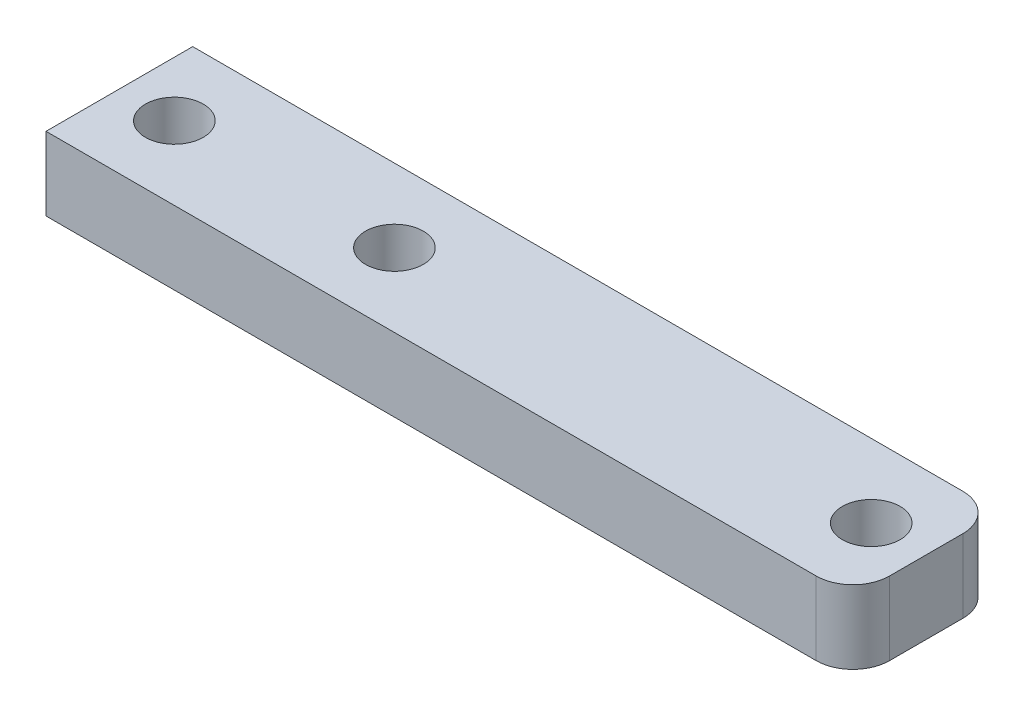
ISO-10303-21;
HEADER;
FILE_DESCRIPTION(('STEP AP214'),'2;1');
FILE_NAME('part.step','',(''),(''),'','','');
FILE_SCHEMA(('AUTOMOTIVE_DESIGN { 1 0 10303 214 1 1 1 1 }'));
ENDSEC;
DATA;
#1=APPLICATION_CONTEXT('core data for automotive mechanical design processes');
#2=APPLICATION_PROTOCOL_DEFINITION('international standard','automotive_design',2000,#1);
#3=PRODUCT_CONTEXT('',#1,'mechanical');
#4=PRODUCT('Part','Part','',(#3));
#5=PRODUCT_RELATED_PRODUCT_CATEGORY('part','',(#4));
#6=PRODUCT_DEFINITION_FORMATION('','',#4);
#7=PRODUCT_DEFINITION_CONTEXT('part definition',#1,'design');
#8=PRODUCT_DEFINITION('design','',#6,#7);
#9=PRODUCT_DEFINITION_SHAPE('','',#8);
#10=(LENGTH_UNIT() NAMED_UNIT(*) SI_UNIT(.MILLI.,.METRE.));
#11=(NAMED_UNIT(*) PLANE_ANGLE_UNIT() SI_UNIT($,.RADIAN.));
#12=(NAMED_UNIT(*) SI_UNIT($,.STERADIAN.) SOLID_ANGLE_UNIT());
#13=UNCERTAINTY_MEASURE_WITH_UNIT(LENGTH_MEASURE(1.E-05),#10,'distance_accuracy_value','');
#14=(GEOMETRIC_REPRESENTATION_CONTEXT(3) GLOBAL_UNCERTAINTY_ASSIGNED_CONTEXT((#13)) GLOBAL_UNIT_ASSIGNED_CONTEXT((#10,
#11,#12)) REPRESENTATION_CONTEXT('',''));
#15=CARTESIAN_POINT('',(0.,0.,0.));
#16=DIRECTION('',(0.,0.,1.));
#17=DIRECTION('',(1.,0.,0.));
#18=AXIS2_PLACEMENT_3D('',#15,#16,#17);
#19=CARTESIAN_POINT('',(0.,6.34999999999997,-6.3500000000003));
#20=DIRECTION('',(1.,0.,0.));
#21=DIRECTION('',(0.,0.,-1.));
#22=AXIS2_PLACEMENT_3D('',#19,#20,#21);
#23=PLANE('',#22);
#24=DIRECTION('',(0.,0.,1.));
#25=VECTOR('',#24,1.);
#26=CARTESIAN_POINT('',(0.,0.,-6.3500000000003));
#27=LINE('',#26,#25);
#28=CARTESIAN_POINT('',(0.,0.,-6.3500000000003));
#29=VERTEX_POINT('',#28);
#30=CARTESIAN_POINT('',(0.,0.,6.3500000000003));
#31=VERTEX_POINT('',#30);
#32=EDGE_CURVE('E109',#29,#31,#27,.T.);
#33=ORIENTED_EDGE('',*,*,#32,.T.);
#34=DIRECTION('',(0.,-1.,0.));
#35=VECTOR('',#34,1.);
#36=CARTESIAN_POINT('',(0.,6.34999999999997,6.3500000000003));
#37=LINE('',#36,#35);
#38=CARTESIAN_POINT('',(0.,6.34999999999997,6.3500000000003));
#39=VERTEX_POINT('',#38);
#40=EDGE_CURVE('E92',#39,#31,#37,.T.);
#41=ORIENTED_EDGE('',*,*,#40,.F.);
#42=DIRECTION('',(0.,0.,1.));
#43=VECTOR('',#42,1.);
#44=CARTESIAN_POINT('',(0.,6.34999999999997,-6.3500000000003));
#45=LINE('',#44,#43);
#46=CARTESIAN_POINT('',(0.,6.34999999999997,-6.3500000000003));
#47=VERTEX_POINT('',#46);
#48=EDGE_CURVE('E97',#47,#39,#45,.T.);
#49=ORIENTED_EDGE('',*,*,#48,.F.);
#50=DIRECTION('',(0.,-1.,0.));
#51=VECTOR('',#50,1.);
#52=CARTESIAN_POINT('',(0.,6.34999999999997,-6.3500000000003));
#53=LINE('',#52,#51);
#54=EDGE_CURVE('E111',#47,#29,#53,.T.);
#55=ORIENTED_EDGE('',*,*,#54,.T.);
#56=EDGE_LOOP('',(#33,#41,#49,#55));
#57=FACE_BOUND('',#56,.T.);
#58=ADVANCED_FACE('F36',(#57),#23,.F.);
#59=CARTESIAN_POINT('',(0.,6.34999999999997,6.3500000000003));
#60=DIRECTION('',(0.,0.,-1.));
#61=DIRECTION('',(-1.,0.,0.));
#62=AXIS2_PLACEMENT_3D('',#59,#60,#61);
#63=PLANE('',#62);
#64=DIRECTION('',(1.,0.,0.));
#65=VECTOR('',#64,1.);
#66=CARTESIAN_POINT('',(0.,0.,6.3500000000003));
#67=LINE('',#66,#65);
#68=CARTESIAN_POINT('',(66.6750000000001,-6.66133814775094E-13,6.3500000000003));
#69=VERTEX_POINT('',#68);
#70=EDGE_CURVE('E141',#31,#69,#67,.T.);
#71=ORIENTED_EDGE('',*,*,#70,.T.);
#72=DIRECTION('',(0.,-1.,0.));
#73=VECTOR('',#72,1.);
#74=CARTESIAN_POINT('',(66.6750000000001,6.34999999999941,6.3500000000003));
#75=LINE('',#74,#73);
#76=CARTESIAN_POINT('',(66.6750000000001,6.34999999999941,6.3500000000003));
#77=VERTEX_POINT('',#76);
#78=EDGE_CURVE('E11',#69,#77,#75,.F.);
#79=ORIENTED_EDGE('',*,*,#78,.T.);
#80=DIRECTION('',(1.,0.,0.));
#81=VECTOR('',#80,1.);
#82=CARTESIAN_POINT('',(0.,6.34999999999997,6.3500000000003));
#83=LINE('',#82,#81);
#84=EDGE_CURVE('E88',#39,#77,#83,.T.);
#85=ORIENTED_EDGE('',*,*,#84,.F.);
#86=ORIENTED_EDGE('',*,*,#40,.T.);
#87=EDGE_LOOP('',(#71,#79,#85,#86));
#88=FACE_BOUND('',#87,.T.);
#89=ADVANCED_FACE('F90',(#88),#63,.F.);
#90=CARTESIAN_POINT('',(69.8499999999998,6.34999999999952,-6.34999999999941));
#91=DIRECTION('',(-1.,0.,0.));
#92=DIRECTION('',(0.,0.,1.));
#93=AXIS2_PLACEMENT_3D('',#90,#91,#92);
#94=PLANE('',#93);
#95=DIRECTION('',(0.,0.,-1.));
#96=VECTOR('',#95,1.);
#97=CARTESIAN_POINT('',(69.8499999999998,-5.55111512312578E-13,-6.34999999999941));
#98=LINE('',#97,#96);
#99=CARTESIAN_POINT('',(69.8499999999998,-6.66133814775094E-13,3.17500000000059));
#100=VERTEX_POINT('',#99);
#101=CARTESIAN_POINT('',(69.8499999999998,-5.55111512312578E-13,-3.17499999999971));
#102=VERTEX_POINT('',#101);
#103=EDGE_CURVE('E138',#100,#102,#98,.T.);
#104=ORIENTED_EDGE('',*,*,#103,.T.);
#105=DIRECTION('',(0.,-1.,0.));
#106=VECTOR('',#105,1.);
#107=CARTESIAN_POINT('',(69.8499999999998,6.34999999999952,-3.17499999999971));
#108=LINE('',#107,#106);
#109=CARTESIAN_POINT('',(69.8499999999998,6.34999999999952,-3.17499999999971));
#110=VERTEX_POINT('',#109);
#111=EDGE_CURVE('E57',#102,#110,#108,.F.);
#112=ORIENTED_EDGE('',*,*,#111,.T.);
#113=DIRECTION('',(0.,0.,-1.));
#114=VECTOR('',#113,1.);
#115=CARTESIAN_POINT('',(69.8499999999998,6.34999999999952,-6.34999999999941));
#116=LINE('',#115,#114);
#117=CARTESIAN_POINT('',(69.8499999999998,6.34999999999941,3.17500000000059));
#118=VERTEX_POINT('',#117);
#119=EDGE_CURVE('E96',#118,#110,#116,.T.);
#120=ORIENTED_EDGE('',*,*,#119,.F.);
#121=DIRECTION('',(0.,-1.,0.));
#122=VECTOR('',#121,1.);
#123=CARTESIAN_POINT('',(69.8499999999998,6.34999999999941,3.17500000000059));
#124=LINE('',#123,#122);
#125=EDGE_CURVE('E122',#118,#100,#124,.T.);
#126=ORIENTED_EDGE('',*,*,#125,.T.);
#127=EDGE_LOOP('',(#104,#112,#120,#126));
#128=FACE_BOUND('',#127,.T.);
#129=ADVANCED_FACE('F139',(#128),#94,.F.);
#130=CARTESIAN_POINT('',(0.,6.34999999999997,-6.3500000000003));
#131=DIRECTION('',(0.,0.,1.));
#132=DIRECTION('',(1.,0.,0.));
#133=AXIS2_PLACEMENT_3D('',#130,#131,#132);
#134=PLANE('',#133);
#135=DIRECTION('',(-1.,0.,0.));
#136=VECTOR('',#135,1.);
#137=CARTESIAN_POINT('',(0.,6.34999999999997,-6.3500000000003));
#138=LINE('',#137,#136);
#139=CARTESIAN_POINT('',(66.6750000000001,6.34999999999952,-6.34999999999941));
#140=VERTEX_POINT('',#139);
#141=EDGE_CURVE('E102',#140,#47,#138,.T.);
#142=ORIENTED_EDGE('',*,*,#141,.F.);
#143=DIRECTION('',(0.,-1.,0.));
#144=VECTOR('',#143,1.);
#145=CARTESIAN_POINT('',(66.6750000000001,6.34999999999952,-6.34999999999941));
#146=LINE('',#145,#144);
#147=CARTESIAN_POINT('',(66.6750000000001,-5.55111512312578E-13,-6.34999999999941));
#148=VERTEX_POINT('',#147);
#149=EDGE_CURVE('E110',#140,#148,#146,.T.);
#150=ORIENTED_EDGE('',*,*,#149,.T.);
#151=DIRECTION('',(-1.,0.,0.));
#152=VECTOR('',#151,1.);
#153=CARTESIAN_POINT('',(0.,0.,-6.3500000000003));
#154=LINE('',#153,#152);
#155=EDGE_CURVE('E106',#148,#29,#154,.T.);
#156=ORIENTED_EDGE('',*,*,#155,.T.);
#157=ORIENTED_EDGE('',*,*,#54,.F.);
#158=EDGE_LOOP('',(#142,#150,#156,#157));
#159=FACE_BOUND('',#158,.T.);
#160=ADVANCED_FACE('F131',(#159),#134,.F.);
#161=CARTESIAN_POINT('',(0.,6.34999999999997,0.));
#162=DIRECTION('',(0.,1.,0.));
#163=DIRECTION('',(0.,0.,1.));
#164=AXIS2_PLACEMENT_3D('',#161,#162,#163);
#165=PLANE('',#164);
#166=CARTESIAN_POINT('',(4.76250000000003,6.34999999999997,8.88178419700125E-13));
#167=DIRECTION('',(0.,1.,0.));
#168=DIRECTION('',(0.,0.,1.));
#169=AXIS2_PLACEMENT_3D('',#166,#167,#168);
#170=CIRCLE('',#169,2.5);
#171=CARTESIAN_POINT('',(4.76250000000003,6.34999999999997,2.50000000000089));
#172=VERTEX_POINT('',#171);
#173=EDGE_CURVE('E162',#172,#172,#170,.T.);
#174=ORIENTED_EDGE('',*,*,#173,.F.);
#175=EDGE_LOOP('',(#174));
#176=FACE_BOUND('',#175,.T.);
#177=CARTESIAN_POINT('',(23.8125000000001,6.34999999999986,8.88178419700125E-13));
#178=DIRECTION('',(0.,1.,0.));
#179=DIRECTION('',(0.,0.,1.));
#180=AXIS2_PLACEMENT_3D('',#177,#178,#179);
#181=CIRCLE('',#180,2.5);
#182=CARTESIAN_POINT('',(23.8125000000001,6.34999999999986,2.50000000000089));
#183=VERTEX_POINT('',#182);
#184=EDGE_CURVE('E156',#183,#183,#181,.T.);
#185=ORIENTED_EDGE('',*,*,#184,.F.);
#186=EDGE_LOOP('',(#185));
#187=FACE_BOUND('',#186,.T.);
#188=CARTESIAN_POINT('',(65.0874999999998,6.34999999999952,8.88178419700125E-13));
#189=DIRECTION('',(0.,1.,0.));
#190=DIRECTION('',(0.,0.,1.));
#191=AXIS2_PLACEMENT_3D('',#188,#189,#190);
#192=CIRCLE('',#191,2.5);
#193=CARTESIAN_POINT('',(65.0874999999998,6.34999999999952,2.50000000000089));
#194=VERTEX_POINT('',#193);
#195=EDGE_CURVE('E150',#194,#194,#192,.T.);
#196=ORIENTED_EDGE('',*,*,#195,.F.);
#197=EDGE_LOOP('',(#196));
#198=FACE_BOUND('',#197,.T.);
#199=ORIENTED_EDGE('',*,*,#119,.T.);
#200=CARTESIAN_POINT('',(66.6750000000001,6.34999999999952,-3.17499999999971));
#201=DIRECTION('',(0.,1.,0.));
#202=DIRECTION('',(0.,0.,1.));
#203=AXIS2_PLACEMENT_3D('',#200,#201,#202);
#204=CIRCLE('',#203,3.175);
#205=EDGE_CURVE('E44',#110,#140,#204,.T.);
#206=ORIENTED_EDGE('',*,*,#205,.T.);
#207=ORIENTED_EDGE('',*,*,#141,.T.);
#208=ORIENTED_EDGE('',*,*,#48,.T.);
#209=ORIENTED_EDGE('',*,*,#84,.T.);
#210=CARTESIAN_POINT('',(66.6750000000001,6.34999999999941,3.17500000000059));
#211=DIRECTION('',(0.,1.,0.));
#212=DIRECTION('',(0.,0.,1.));
#213=AXIS2_PLACEMENT_3D('',#210,#211,#212);
#214=CIRCLE('',#213,3.175);
#215=EDGE_CURVE('E126',#77,#118,#214,.T.);
#216=ORIENTED_EDGE('',*,*,#215,.T.);
#217=EDGE_LOOP('',(#199,#206,#207,#208,#209,#216));
#218=FACE_BOUND('',#217,.T.);
#219=ADVANCED_FACE('F100',(#176,#187,#198,#218),#165,.T.);
#220=CARTESIAN_POINT('',(0.,0.,0.));
#221=DIRECTION('',(0.,1.,0.));
#222=DIRECTION('',(0.,0.,1.));
#223=AXIS2_PLACEMENT_3D('',#220,#221,#222);
#224=PLANE('',#223);
#225=CARTESIAN_POINT('',(4.76250000000003,0.,8.88178419700125E-13));
#226=DIRECTION('',(0.,1.,0.));
#227=DIRECTION('',(0.,0.,1.));
#228=AXIS2_PLACEMENT_3D('',#225,#226,#227);
#229=CIRCLE('',#228,2.5);
#230=CARTESIAN_POINT('',(4.76250000000003,0.,2.50000000000089));
#231=VERTEX_POINT('',#230);
#232=EDGE_CURVE('E159',#231,#231,#229,.T.);
#233=ORIENTED_EDGE('',*,*,#232,.T.);
#234=EDGE_LOOP('',(#233));
#235=FACE_BOUND('',#234,.T.);
#236=CARTESIAN_POINT('',(23.8125,-1.11022302462516E-13,8.88178419700125E-13));
#237=DIRECTION('',(0.,1.,0.));
#238=DIRECTION('',(0.,0.,1.));
#239=AXIS2_PLACEMENT_3D('',#236,#237,#238);
#240=CIRCLE('',#239,2.5);
#241=CARTESIAN_POINT('',(23.8125,-1.11022302462516E-13,2.50000000000089));
#242=VERTEX_POINT('',#241);
#243=EDGE_CURVE('E153',#242,#242,#240,.T.);
#244=ORIENTED_EDGE('',*,*,#243,.T.);
#245=EDGE_LOOP('',(#244));
#246=FACE_BOUND('',#245,.T.);
#247=CARTESIAN_POINT('',(65.0874999999998,-5.55111512312578E-13,0.));
#248=DIRECTION('',(0.,1.,0.));
#249=DIRECTION('',(0.,0.,1.));
#250=AXIS2_PLACEMENT_3D('',#247,#248,#249);
#251=CIRCLE('',#250,2.5);
#252=CARTESIAN_POINT('',(65.0874999999998,-5.55111512312578E-13,2.5));
#253=VERTEX_POINT('',#252);
#254=EDGE_CURVE('E145',#253,#253,#251,.T.);
#255=ORIENTED_EDGE('',*,*,#254,.T.);
#256=EDGE_LOOP('',(#255));
#257=FACE_BOUND('',#256,.T.);
#258=ORIENTED_EDGE('',*,*,#155,.F.);
#259=CARTESIAN_POINT('',(66.6750000000001,-5.55111512312578E-13,-3.17499999999971));
#260=DIRECTION('',(0.,1.,0.));
#261=DIRECTION('',(0.,0.,1.));
#262=AXIS2_PLACEMENT_3D('',#259,#260,#261);
#263=CIRCLE('',#262,3.175);
#264=EDGE_CURVE('E120',#148,#102,#263,.F.);
#265=ORIENTED_EDGE('',*,*,#264,.T.);
#266=ORIENTED_EDGE('',*,*,#103,.F.);
#267=CARTESIAN_POINT('',(66.6750000000001,-6.66133814775094E-13,3.17500000000059));
#268=DIRECTION('',(0.,1.,0.));
#269=DIRECTION('',(0.,0.,1.));
#270=AXIS2_PLACEMENT_3D('',#267,#268,#269);
#271=CIRCLE('',#270,3.175);
#272=EDGE_CURVE('E114',#100,#69,#271,.F.);
#273=ORIENTED_EDGE('',*,*,#272,.T.);
#274=ORIENTED_EDGE('',*,*,#70,.F.);
#275=ORIENTED_EDGE('',*,*,#32,.F.);
#276=EDGE_LOOP('',(#258,#265,#266,#273,#274,#275));
#277=FACE_BOUND('',#276,.T.);
#278=ADVANCED_FACE('F137',(#235,#246,#257,#277),#224,.F.);
#279=CARTESIAN_POINT('',(65.0874999999998,6.34999999999952,8.88178419700125E-13));
#280=DIRECTION('',(0.,1.,0.));
#281=DIRECTION('',(0.,0.,1.));
#282=AXIS2_PLACEMENT_3D('',#279,#280,#281);
#283=CYLINDRICAL_SURFACE('',#282,2.5);
#284=ORIENTED_EDGE('',*,*,#254,.F.);
#285=EDGE_LOOP('',(#284));
#286=FACE_BOUND('',#285,.T.);
#287=ORIENTED_EDGE('',*,*,#195,.T.);
#288=EDGE_LOOP('',(#287));
#289=FACE_BOUND('',#288,.T.);
#290=ADVANCED_FACE('F175',(#286,#289),#283,.F.);
#291=CARTESIAN_POINT('',(23.8125000000001,6.34999999999986,8.88178419700125E-13));
#292=DIRECTION('',(0.,1.,0.));
#293=DIRECTION('',(0.,0.,1.));
#294=AXIS2_PLACEMENT_3D('',#291,#292,#293);
#295=CYLINDRICAL_SURFACE('',#294,2.5);
#296=ORIENTED_EDGE('',*,*,#243,.F.);
#297=EDGE_LOOP('',(#296));
#298=FACE_BOUND('',#297,.T.);
#299=ORIENTED_EDGE('',*,*,#184,.T.);
#300=EDGE_LOOP('',(#299));
#301=FACE_BOUND('',#300,.T.);
#302=ADVANCED_FACE('F177',(#298,#301),#295,.F.);
#303=CARTESIAN_POINT('',(4.76250000000003,6.34999999999997,8.88178419700125E-13));
#304=DIRECTION('',(0.,1.,0.));
#305=DIRECTION('',(0.,0.,1.));
#306=AXIS2_PLACEMENT_3D('',#303,#304,#305);
#307=CYLINDRICAL_SURFACE('',#306,2.5);
#308=ORIENTED_EDGE('',*,*,#232,.F.);
#309=EDGE_LOOP('',(#308));
#310=FACE_BOUND('',#309,.T.);
#311=ORIENTED_EDGE('',*,*,#173,.T.);
#312=EDGE_LOOP('',(#311));
#313=FACE_BOUND('',#312,.T.);
#314=ADVANCED_FACE('F166',(#310,#313),#307,.F.);
#315=CARTESIAN_POINT('',(66.6750000000001,6.34999999999952,-3.17499999999971));
#316=DIRECTION('',(0.,-1.,0.));
#317=DIRECTION('',(0.,0.,-1.));
#318=AXIS2_PLACEMENT_3D('',#315,#316,#317);
#319=CYLINDRICAL_SURFACE('',#318,3.175);
#320=ORIENTED_EDGE('',*,*,#205,.F.);
#321=ORIENTED_EDGE('',*,*,#111,.F.);
#322=ORIENTED_EDGE('',*,*,#264,.F.);
#323=ORIENTED_EDGE('',*,*,#149,.F.);
#324=EDGE_LOOP('',(#320,#321,#322,#323));
#325=FACE_BOUND('',#324,.T.);
#326=ADVANCED_FACE('F134',(#325),#319,.T.);
#327=CARTESIAN_POINT('',(66.6750000000001,6.34999999999941,3.17500000000059));
#328=DIRECTION('',(0.,-1.,0.));
#329=DIRECTION('',(0.,0.,-1.));
#330=AXIS2_PLACEMENT_3D('',#327,#328,#329);
#331=CYLINDRICAL_SURFACE('',#330,3.175);
#332=ORIENTED_EDGE('',*,*,#215,.F.);
#333=ORIENTED_EDGE('',*,*,#78,.F.);
#334=ORIENTED_EDGE('',*,*,#272,.F.);
#335=ORIENTED_EDGE('',*,*,#125,.F.);
#336=EDGE_LOOP('',(#332,#333,#334,#335));
#337=FACE_BOUND('',#336,.T.);
#338=ADVANCED_FACE('F38',(#337),#331,.T.);
#339=CLOSED_SHELL('',(#58,#89,#129,#160,#219,#278,#290,#302,#314,#326,#338));
#340=MANIFOLD_SOLID_BREP('B2',#339);
#341=ADVANCED_BREP_SHAPE_REPRESENTATION('',(#18,#340),#14);
#342=SHAPE_DEFINITION_REPRESENTATION(#9,#341);
ENDSEC;
END-ISO-10303-21;
